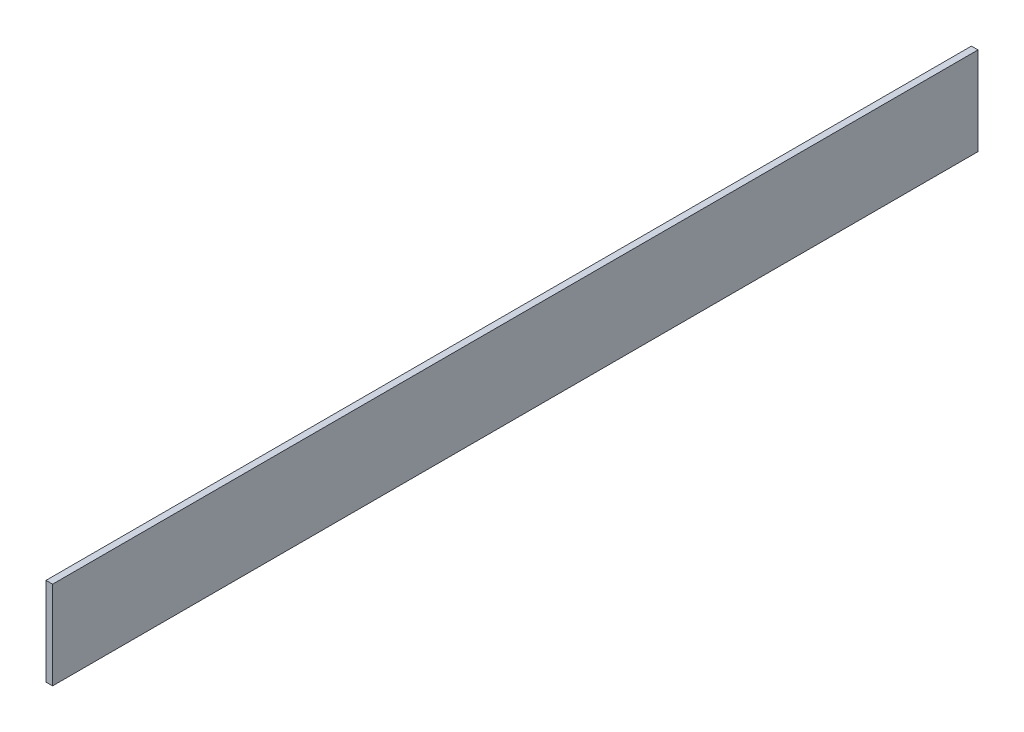
ISO-10303-21;
HEADER;
FILE_DESCRIPTION(('STEP AP214'),'2;1');
FILE_NAME('part.step','',(''),(''),'','','');
FILE_SCHEMA(('AUTOMOTIVE_DESIGN { 1 0 10303 214 1 1 1 1 }'));
ENDSEC;
DATA;
#1=APPLICATION_CONTEXT('core data for automotive mechanical design processes');
#2=APPLICATION_PROTOCOL_DEFINITION('international standard','automotive_design',2000,#1);
#3=PRODUCT_CONTEXT('',#1,'mechanical');
#4=PRODUCT('Part','Part','',(#3));
#5=PRODUCT_RELATED_PRODUCT_CATEGORY('part','',(#4));
#6=PRODUCT_DEFINITION_FORMATION('','',#4);
#7=PRODUCT_DEFINITION_CONTEXT('part definition',#1,'design');
#8=PRODUCT_DEFINITION('design','',#6,#7);
#9=PRODUCT_DEFINITION_SHAPE('','',#8);
#10=(LENGTH_UNIT() NAMED_UNIT(*) SI_UNIT(.MILLI.,.METRE.));
#11=(NAMED_UNIT(*) PLANE_ANGLE_UNIT() SI_UNIT($,.RADIAN.));
#12=(NAMED_UNIT(*) SI_UNIT($,.STERADIAN.) SOLID_ANGLE_UNIT());
#13=UNCERTAINTY_MEASURE_WITH_UNIT(LENGTH_MEASURE(1.E-05),#10,'distance_accuracy_value','');
#14=(GEOMETRIC_REPRESENTATION_CONTEXT(3) GLOBAL_UNCERTAINTY_ASSIGNED_CONTEXT((#13)) GLOBAL_UNIT_ASSIGNED_CONTEXT((#10,
#11,#12)) REPRESENTATION_CONTEXT('',''));
#15=CARTESIAN_POINT('',(0.,0.,0.));
#16=DIRECTION('',(0.,0.,1.));
#17=DIRECTION('',(1.,0.,0.));
#18=AXIS2_PLACEMENT_3D('',#15,#16,#17);
#19=CARTESIAN_POINT('',(3.,0.,0.));
#20=DIRECTION('',(0.,0.,-1.));
#21=DIRECTION('',(-1.,0.,0.));
#22=AXIS2_PLACEMENT_3D('',#19,#20,#21);
#23=PLANE('',#22);
#24=DIRECTION('',(0.,-1.,0.));
#25=VECTOR('',#24,1.);
#26=CARTESIAN_POINT('',(0.,0.,0.));
#27=LINE('',#26,#25);
#28=CARTESIAN_POINT('',(0.,40.,0.));
#29=VERTEX_POINT('',#28);
#30=CARTESIAN_POINT('',(0.,0.,0.));
#31=VERTEX_POINT('',#30);
#32=EDGE_CURVE('E95',#29,#31,#27,.T.);
#33=ORIENTED_EDGE('',*,*,#32,.T.);
#34=DIRECTION('',(-1.,0.,0.));
#35=VECTOR('',#34,1.);
#36=CARTESIAN_POINT('',(3.,0.,0.));
#37=LINE('',#36,#35);
#38=CARTESIAN_POINT('',(3.,0.,0.));
#39=VERTEX_POINT('',#38);
#40=EDGE_CURVE('E11',#39,#31,#37,.T.);
#41=ORIENTED_EDGE('',*,*,#40,.F.);
#42=DIRECTION('',(0.,-1.,0.));
#43=VECTOR('',#42,1.);
#44=CARTESIAN_POINT('',(3.,0.,0.));
#45=LINE('',#44,#43);
#46=CARTESIAN_POINT('',(3.,40.,0.));
#47=VERTEX_POINT('',#46);
#48=EDGE_CURVE('E83',#47,#39,#45,.T.);
#49=ORIENTED_EDGE('',*,*,#48,.F.);
#50=DIRECTION('',(-1.,0.,0.));
#51=VECTOR('',#50,1.);
#52=CARTESIAN_POINT('',(3.,40.,0.));
#53=LINE('',#52,#51);
#54=EDGE_CURVE('E91',#47,#29,#53,.T.);
#55=ORIENTED_EDGE('',*,*,#54,.T.);
#56=EDGE_LOOP('',(#33,#41,#49,#55));
#57=FACE_BOUND('',#56,.T.);
#58=ADVANCED_FACE('F32',(#57),#23,.F.);
#59=CARTESIAN_POINT('',(3.,0.,0.));
#60=DIRECTION('',(0.,1.,0.));
#61=DIRECTION('',(0.,0.,1.));
#62=AXIS2_PLACEMENT_3D('',#59,#60,#61);
#63=PLANE('',#62);
#64=DIRECTION('',(0.,0.,-1.));
#65=VECTOR('',#64,1.);
#66=CARTESIAN_POINT('',(0.,0.,0.));
#67=LINE('',#66,#65);
#68=CARTESIAN_POINT('',(0.,0.,-420.));
#69=VERTEX_POINT('',#68);
#70=EDGE_CURVE('E87',#31,#69,#67,.T.);
#71=ORIENTED_EDGE('',*,*,#70,.T.);
#72=DIRECTION('',(-1.,0.,0.));
#73=VECTOR('',#72,1.);
#74=CARTESIAN_POINT('',(3.,0.,-420.));
#75=LINE('',#74,#73);
#76=CARTESIAN_POINT('',(3.,0.,-420.));
#77=VERTEX_POINT('',#76);
#78=EDGE_CURVE('E40',#77,#69,#75,.T.);
#79=ORIENTED_EDGE('',*,*,#78,.F.);
#80=DIRECTION('',(0.,0.,-1.));
#81=VECTOR('',#80,1.);
#82=CARTESIAN_POINT('',(3.,0.,0.));
#83=LINE('',#82,#81);
#84=EDGE_CURVE('E78',#39,#77,#83,.T.);
#85=ORIENTED_EDGE('',*,*,#84,.F.);
#86=ORIENTED_EDGE('',*,*,#40,.T.);
#87=EDGE_LOOP('',(#71,#79,#85,#86));
#88=FACE_BOUND('',#87,.T.);
#89=ADVANCED_FACE('F86',(#88),#63,.F.);
#90=CARTESIAN_POINT('',(3.,0.,-420.));
#91=DIRECTION('',(0.,0.,1.));
#92=DIRECTION('',(1.,0.,0.));
#93=AXIS2_PLACEMENT_3D('',#90,#91,#92);
#94=PLANE('',#93);
#95=DIRECTION('',(0.,1.,0.));
#96=VECTOR('',#95,1.);
#97=CARTESIAN_POINT('',(0.,0.,-420.));
#98=LINE('',#97,#96);
#99=CARTESIAN_POINT('',(0.,40.,-420.));
#100=VERTEX_POINT('',#99);
#101=EDGE_CURVE('E65',#69,#100,#98,.T.);
#102=ORIENTED_EDGE('',*,*,#101,.T.);
#103=DIRECTION('',(-1.,0.,0.));
#104=VECTOR('',#103,1.);
#105=CARTESIAN_POINT('',(3.,40.,-420.));
#106=LINE('',#105,#104);
#107=CARTESIAN_POINT('',(3.,40.,-420.));
#108=VERTEX_POINT('',#107);
#109=EDGE_CURVE('E88',#108,#100,#106,.T.);
#110=ORIENTED_EDGE('',*,*,#109,.F.);
#111=DIRECTION('',(0.,1.,0.));
#112=VECTOR('',#111,1.);
#113=CARTESIAN_POINT('',(3.,0.,-420.));
#114=LINE('',#113,#112);
#115=EDGE_CURVE('E81',#77,#108,#114,.T.);
#116=ORIENTED_EDGE('',*,*,#115,.F.);
#117=ORIENTED_EDGE('',*,*,#78,.T.);
#118=EDGE_LOOP('',(#102,#110,#116,#117));
#119=FACE_BOUND('',#118,.T.);
#120=ADVANCED_FACE('F89',(#119),#94,.F.);
#121=CARTESIAN_POINT('',(3.,40.,0.));
#122=DIRECTION('',(0.,-1.,0.));
#123=DIRECTION('',(0.,0.,-1.));
#124=AXIS2_PLACEMENT_3D('',#121,#122,#123);
#125=PLANE('',#124);
#126=DIRECTION('',(0.,0.,1.));
#127=VECTOR('',#126,1.);
#128=CARTESIAN_POINT('',(0.,40.,0.));
#129=LINE('',#128,#127);
#130=EDGE_CURVE('E71',#100,#29,#129,.T.);
#131=ORIENTED_EDGE('',*,*,#130,.T.);
#132=ORIENTED_EDGE('',*,*,#54,.F.);
#133=DIRECTION('',(0.,0.,1.));
#134=VECTOR('',#133,1.);
#135=CARTESIAN_POINT('',(3.,40.,0.));
#136=LINE('',#135,#134);
#137=EDGE_CURVE('E48',#108,#47,#136,.T.);
#138=ORIENTED_EDGE('',*,*,#137,.F.);
#139=ORIENTED_EDGE('',*,*,#109,.T.);
#140=EDGE_LOOP('',(#131,#132,#138,#139));
#141=FACE_BOUND('',#140,.T.);
#142=ADVANCED_FACE('F102',(#141),#125,.F.);
#143=CARTESIAN_POINT('',(3.,0.,0.));
#144=DIRECTION('',(-1.,0.,0.));
#145=DIRECTION('',(0.,0.,1.));
#146=AXIS2_PLACEMENT_3D('',#143,#144,#145);
#147=PLANE('',#146);
#148=ORIENTED_EDGE('',*,*,#48,.T.);
#149=ORIENTED_EDGE('',*,*,#84,.T.);
#150=ORIENTED_EDGE('',*,*,#115,.T.);
#151=ORIENTED_EDGE('',*,*,#137,.T.);
#152=EDGE_LOOP('',(#148,#149,#150,#151));
#153=FACE_BOUND('',#152,.T.);
#154=ADVANCED_FACE('F79',(#153),#147,.F.);
#155=CARTESIAN_POINT('',(0.,0.,0.));
#156=DIRECTION('',(-1.,0.,0.));
#157=DIRECTION('',(0.,0.,1.));
#158=AXIS2_PLACEMENT_3D('',#155,#156,#157);
#159=PLANE('',#158);
#160=ORIENTED_EDGE('',*,*,#32,.F.);
#161=ORIENTED_EDGE('',*,*,#130,.F.);
#162=ORIENTED_EDGE('',*,*,#101,.F.);
#163=ORIENTED_EDGE('',*,*,#70,.F.);
#164=EDGE_LOOP('',(#160,#161,#162,#163));
#165=FACE_BOUND('',#164,.T.);
#166=ADVANCED_FACE('F105',(#165),#159,.T.);
#167=CLOSED_SHELL('',(#58,#89,#120,#142,#154,#166));
#168=MANIFOLD_SOLID_BREP('B2',#167);
#169=ADVANCED_BREP_SHAPE_REPRESENTATION('',(#18,#168),#14);
#170=SHAPE_DEFINITION_REPRESENTATION(#9,#169);
ENDSEC;
END-ISO-10303-21;
